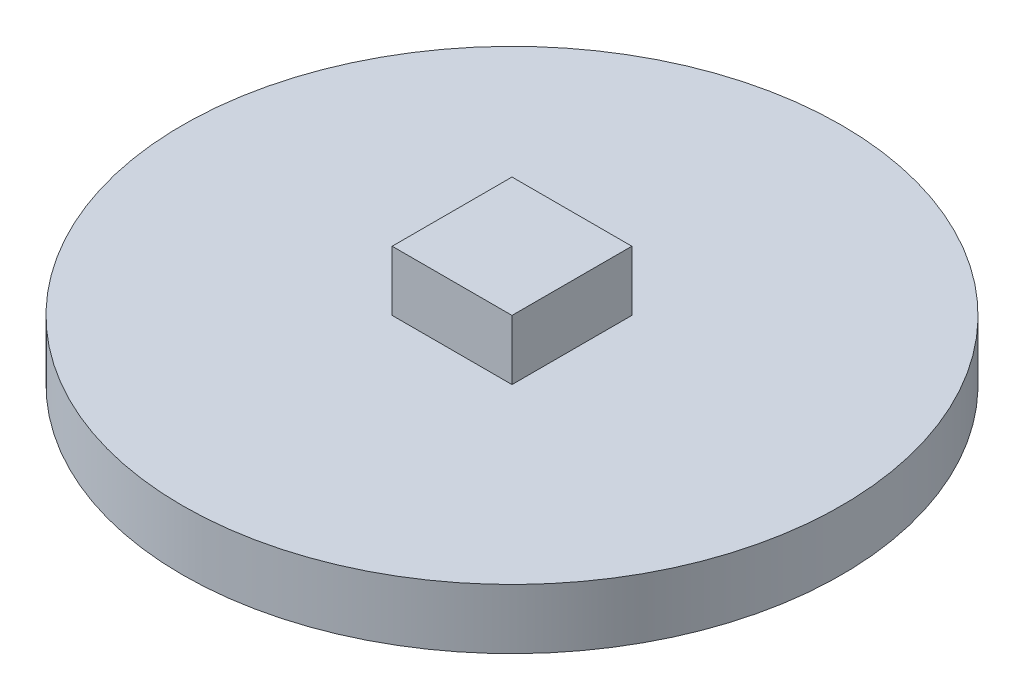
ISO-10303-21;
HEADER;
FILE_DESCRIPTION(('STEP AP214'),'2;1');
FILE_NAME('part.step','',(''),(''),'','','');
FILE_SCHEMA(('AUTOMOTIVE_DESIGN { 1 0 10303 214 1 1 1 1 }'));
ENDSEC;
DATA;
#1=APPLICATION_CONTEXT('core data for automotive mechanical design processes');
#2=APPLICATION_PROTOCOL_DEFINITION('international standard','automotive_design',2000,#1);
#3=PRODUCT_CONTEXT('',#1,'mechanical');
#4=PRODUCT('Part','Part','',(#3));
#5=PRODUCT_RELATED_PRODUCT_CATEGORY('part','',(#4));
#6=PRODUCT_DEFINITION_FORMATION('','',#4);
#7=PRODUCT_DEFINITION_CONTEXT('part definition',#1,'design');
#8=PRODUCT_DEFINITION('design','',#6,#7);
#9=PRODUCT_DEFINITION_SHAPE('','',#8);
#10=(LENGTH_UNIT() NAMED_UNIT(*) SI_UNIT(.MILLI.,.METRE.));
#11=(NAMED_UNIT(*) PLANE_ANGLE_UNIT() SI_UNIT($,.RADIAN.));
#12=(NAMED_UNIT(*) SI_UNIT($,.STERADIAN.) SOLID_ANGLE_UNIT());
#13=UNCERTAINTY_MEASURE_WITH_UNIT(LENGTH_MEASURE(1.E-05),#10,'distance_accuracy_value','');
#14=(GEOMETRIC_REPRESENTATION_CONTEXT(3) GLOBAL_UNCERTAINTY_ASSIGNED_CONTEXT((#13)) GLOBAL_UNIT_ASSIGNED_CONTEXT((#10,
#11,#12)) REPRESENTATION_CONTEXT('',''));
#15=CARTESIAN_POINT('',(0.,0.,0.));
#16=DIRECTION('',(0.,0.,1.));
#17=DIRECTION('',(1.,0.,0.));
#18=AXIS2_PLACEMENT_3D('',#15,#16,#17);
#19=CARTESIAN_POINT('',(0.,2.,0.));
#20=DIRECTION('',(0.,1.,0.));
#21=DIRECTION('',(0.,0.,1.));
#22=AXIS2_PLACEMENT_3D('',#19,#20,#21);
#23=PLANE('',#22);
#24=CARTESIAN_POINT('',(0.,2.,0.));
#25=DIRECTION('',(0.,1.,0.));
#26=DIRECTION('',(0.,0.,1.));
#27=AXIS2_PLACEMENT_3D('',#24,#25,#26);
#28=CIRCLE('',#27,11.);
#29=CARTESIAN_POINT('',(0.,2.,11.));
#30=VERTEX_POINT('',#29);
#31=EDGE_CURVE('E11',#30,#30,#28,.T.);
#32=ORIENTED_EDGE('',*,*,#31,.T.);
#33=EDGE_LOOP('',(#32));
#34=FACE_BOUND('',#33,.T.);
#35=DIRECTION('',(1.,0.,0.));
#36=VECTOR('',#35,1.);
#37=CARTESIAN_POINT('',(2.,2.,2.));
#38=LINE('',#37,#36);
#39=CARTESIAN_POINT('',(-2.,2.,2.));
#40=VERTEX_POINT('',#39);
#41=CARTESIAN_POINT('',(2.,2.,2.));
#42=VERTEX_POINT('',#41);
#43=EDGE_CURVE('E89',#40,#42,#38,.T.);
#44=ORIENTED_EDGE('',*,*,#43,.F.);
#45=DIRECTION('',(0.,0.,1.));
#46=VECTOR('',#45,1.);
#47=CARTESIAN_POINT('',(-2.,2.,-2.));
#48=LINE('',#47,#46);
#49=CARTESIAN_POINT('',(-2.,2.,-2.));
#50=VERTEX_POINT('',#49);
#51=EDGE_CURVE('E100',#50,#40,#48,.T.);
#52=ORIENTED_EDGE('',*,*,#51,.F.);
#53=DIRECTION('',(-1.,0.,0.));
#54=VECTOR('',#53,1.);
#55=CARTESIAN_POINT('',(2.,2.,-2.));
#56=LINE('',#55,#54);
#57=CARTESIAN_POINT('',(2.,2.,-2.));
#58=VERTEX_POINT('',#57);
#59=EDGE_CURVE('E70',#58,#50,#56,.T.);
#60=ORIENTED_EDGE('',*,*,#59,.F.);
#61=DIRECTION('',(0.,0.,-1.));
#62=VECTOR('',#61,1.);
#63=CARTESIAN_POINT('',(2.,2.,-2.));
#64=LINE('',#63,#62);
#65=EDGE_CURVE('E104',#42,#58,#64,.T.);
#66=ORIENTED_EDGE('',*,*,#65,.F.);
#67=EDGE_LOOP('',(#44,#52,#60,#66));
#68=FACE_BOUND('',#67,.T.);
#69=ADVANCED_FACE('F33',(#34,#68),#23,.T.);
#70=CARTESIAN_POINT('',(0.,2.,0.));
#71=DIRECTION('',(0.,-1.,0.));
#72=DIRECTION('',(0.,0.,-1.));
#73=AXIS2_PLACEMENT_3D('',#70,#71,#72);
#74=CYLINDRICAL_SURFACE('',#73,11.);
#75=ORIENTED_EDGE('',*,*,#31,.F.);
#76=EDGE_LOOP('',(#75));
#77=FACE_BOUND('',#76,.T.);
#78=CARTESIAN_POINT('',(0.,0.,0.));
#79=DIRECTION('',(0.,1.,0.));
#80=DIRECTION('',(0.,0.,1.));
#81=AXIS2_PLACEMENT_3D('',#78,#79,#80);
#82=CIRCLE('',#81,11.);
#83=CARTESIAN_POINT('',(0.,0.,11.));
#84=VERTEX_POINT('',#83);
#85=EDGE_CURVE('E37',#84,#84,#82,.T.);
#86=ORIENTED_EDGE('',*,*,#85,.T.);
#87=EDGE_LOOP('',(#86));
#88=FACE_BOUND('',#87,.T.);
#89=ADVANCED_FACE('F35',(#77,#88),#74,.T.);
#90=CARTESIAN_POINT('',(0.,0.,0.));
#91=DIRECTION('',(0.,1.,0.));
#92=DIRECTION('',(0.,0.,1.));
#93=AXIS2_PLACEMENT_3D('',#90,#91,#92);
#94=PLANE('',#93);
#95=ORIENTED_EDGE('',*,*,#85,.F.);
#96=EDGE_LOOP('',(#95));
#97=FACE_BOUND('',#96,.T.);
#98=ADVANCED_FACE('F113',(#97),#94,.F.);
#99=CARTESIAN_POINT('',(-2.,4.,-2.));
#100=DIRECTION('',(1.,0.,0.));
#101=DIRECTION('',(0.,0.,-1.));
#102=AXIS2_PLACEMENT_3D('',#99,#100,#101);
#103=PLANE('',#102);
#104=ORIENTED_EDGE('',*,*,#51,.T.);
#105=DIRECTION('',(0.,-1.,0.));
#106=VECTOR('',#105,1.);
#107=CARTESIAN_POINT('',(-2.,4.,2.));
#108=LINE('',#107,#106);
#109=CARTESIAN_POINT('',(-2.,4.,2.));
#110=VERTEX_POINT('',#109);
#111=EDGE_CURVE('E92',#110,#40,#108,.T.);
#112=ORIENTED_EDGE('',*,*,#111,.F.);
#113=DIRECTION('',(0.,0.,1.));
#114=VECTOR('',#113,1.);
#115=CARTESIAN_POINT('',(-2.,4.,-2.));
#116=LINE('',#115,#114);
#117=CARTESIAN_POINT('',(-2.,4.,-2.));
#118=VERTEX_POINT('',#117);
#119=EDGE_CURVE('E82',#118,#110,#116,.T.);
#120=ORIENTED_EDGE('',*,*,#119,.F.);
#121=DIRECTION('',(0.,-1.,0.));
#122=VECTOR('',#121,1.);
#123=CARTESIAN_POINT('',(-2.,4.,-2.));
#124=LINE('',#123,#122);
#125=EDGE_CURVE('E96',#118,#50,#124,.T.);
#126=ORIENTED_EDGE('',*,*,#125,.T.);
#127=EDGE_LOOP('',(#104,#112,#120,#126));
#128=FACE_BOUND('',#127,.T.);
#129=ADVANCED_FACE('F115',(#128),#103,.F.);
#130=CARTESIAN_POINT('',(2.,4.,2.));
#131=DIRECTION('',(0.,0.,-1.));
#132=DIRECTION('',(-1.,0.,0.));
#133=AXIS2_PLACEMENT_3D('',#130,#131,#132);
#134=PLANE('',#133);
#135=ORIENTED_EDGE('',*,*,#43,.T.);
#136=DIRECTION('',(0.,-1.,0.));
#137=VECTOR('',#136,1.);
#138=CARTESIAN_POINT('',(2.,4.,2.));
#139=LINE('',#138,#137);
#140=CARTESIAN_POINT('',(2.,4.,2.));
#141=VERTEX_POINT('',#140);
#142=EDGE_CURVE('E86',#141,#42,#139,.T.);
#143=ORIENTED_EDGE('',*,*,#142,.F.);
#144=DIRECTION('',(1.,0.,0.));
#145=VECTOR('',#144,1.);
#146=CARTESIAN_POINT('',(2.,4.,2.));
#147=LINE('',#146,#145);
#148=EDGE_CURVE('E77',#110,#141,#147,.T.);
#149=ORIENTED_EDGE('',*,*,#148,.F.);
#150=ORIENTED_EDGE('',*,*,#111,.T.);
#151=EDGE_LOOP('',(#135,#143,#149,#150));
#152=FACE_BOUND('',#151,.T.);
#153=ADVANCED_FACE('F87',(#152),#134,.F.);
#154=CARTESIAN_POINT('',(2.,4.,-2.));
#155=DIRECTION('',(-1.,0.,0.));
#156=DIRECTION('',(0.,0.,1.));
#157=AXIS2_PLACEMENT_3D('',#154,#155,#156);
#158=PLANE('',#157);
#159=ORIENTED_EDGE('',*,*,#65,.T.);
#160=DIRECTION('',(0.,-1.,0.));
#161=VECTOR('',#160,1.);
#162=CARTESIAN_POINT('',(2.,4.,-2.));
#163=LINE('',#162,#161);
#164=CARTESIAN_POINT('',(2.,4.,-2.));
#165=VERTEX_POINT('',#164);
#166=EDGE_CURVE('E48',#165,#58,#163,.T.);
#167=ORIENTED_EDGE('',*,*,#166,.F.);
#168=DIRECTION('',(0.,0.,-1.));
#169=VECTOR('',#168,1.);
#170=CARTESIAN_POINT('',(2.,4.,-2.));
#171=LINE('',#170,#169);
#172=EDGE_CURVE('E80',#141,#165,#171,.T.);
#173=ORIENTED_EDGE('',*,*,#172,.F.);
#174=ORIENTED_EDGE('',*,*,#142,.T.);
#175=EDGE_LOOP('',(#159,#167,#173,#174));
#176=FACE_BOUND('',#175,.T.);
#177=ADVANCED_FACE('F94',(#176),#158,.F.);
#178=CARTESIAN_POINT('',(2.,4.,-2.));
#179=DIRECTION('',(0.,0.,1.));
#180=DIRECTION('',(1.,0.,0.));
#181=AXIS2_PLACEMENT_3D('',#178,#179,#180);
#182=PLANE('',#181);
#183=ORIENTED_EDGE('',*,*,#59,.T.);
#184=ORIENTED_EDGE('',*,*,#125,.F.);
#185=DIRECTION('',(-1.,0.,0.));
#186=VECTOR('',#185,1.);
#187=CARTESIAN_POINT('',(2.,4.,-2.));
#188=LINE('',#187,#186);
#189=EDGE_CURVE('E56',#165,#118,#188,.T.);
#190=ORIENTED_EDGE('',*,*,#189,.F.);
#191=ORIENTED_EDGE('',*,*,#166,.T.);
#192=EDGE_LOOP('',(#183,#184,#190,#191));
#193=FACE_BOUND('',#192,.T.);
#194=ADVANCED_FACE('F134',(#193),#182,.F.);
#195=CARTESIAN_POINT('',(0.,4.,0.));
#196=DIRECTION('',(0.,-1.,0.));
#197=DIRECTION('',(0.,0.,-1.));
#198=AXIS2_PLACEMENT_3D('',#195,#196,#197);
#199=PLANE('',#198);
#200=ORIENTED_EDGE('',*,*,#119,.T.);
#201=ORIENTED_EDGE('',*,*,#148,.T.);
#202=ORIENTED_EDGE('',*,*,#172,.T.);
#203=ORIENTED_EDGE('',*,*,#189,.T.);
#204=EDGE_LOOP('',(#200,#201,#202,#203));
#205=FACE_BOUND('',#204,.T.);
#206=ADVANCED_FACE('F78',(#205),#199,.F.);
#207=CLOSED_SHELL('',(#69,#89,#98,#129,#153,#177,#194,#206));
#208=MANIFOLD_SOLID_BREP('B2',#207);
#209=ADVANCED_BREP_SHAPE_REPRESENTATION('',(#18,#208),#14);
#210=SHAPE_DEFINITION_REPRESENTATION(#9,#209);
ENDSEC;
END-ISO-10303-21;
